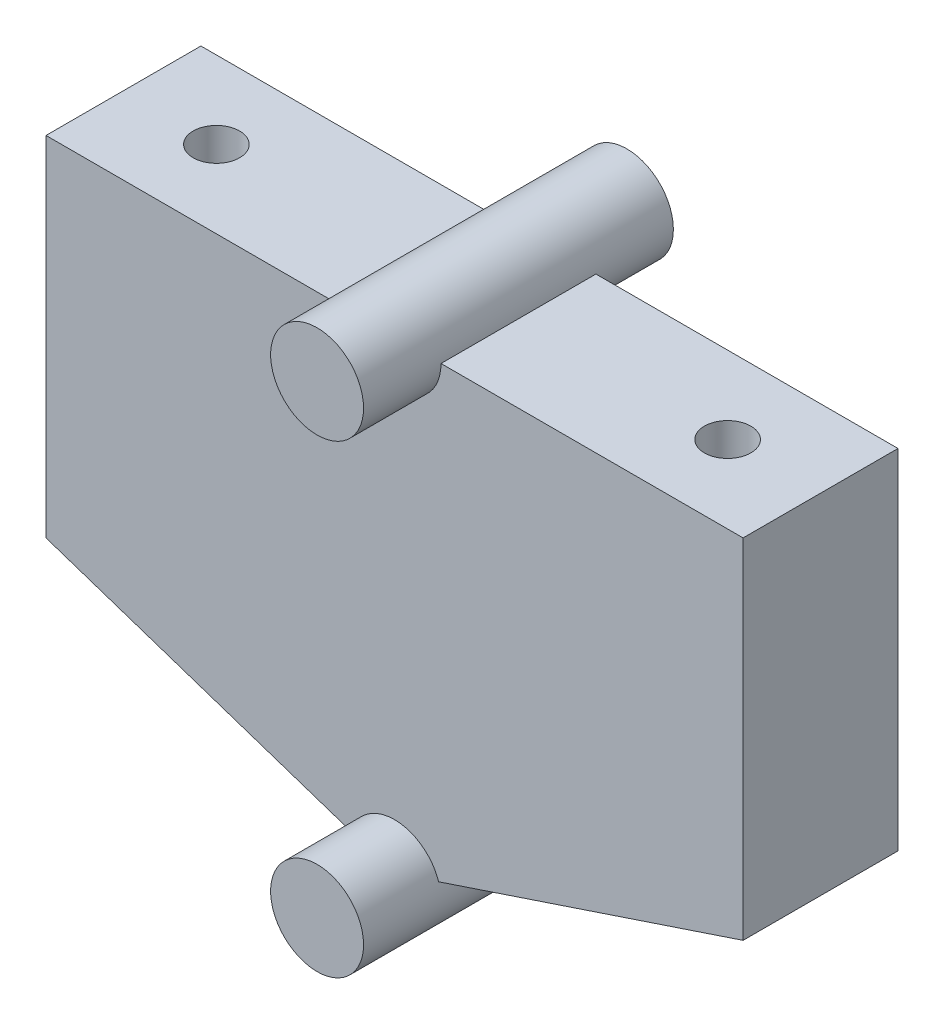
ISO-10303-21;
HEADER;
FILE_DESCRIPTION(('STEP AP214'),'2;1');
FILE_NAME('part.step','',(''),(''),'','','');
FILE_SCHEMA(('AUTOMOTIVE_DESIGN { 1 0 10303 214 1 1 1 1 }'));
ENDSEC;
DATA;
#1=APPLICATION_CONTEXT('core data for automotive mechanical design processes');
#2=APPLICATION_PROTOCOL_DEFINITION('international standard','automotive_design',2000,#1);
#3=PRODUCT_CONTEXT('',#1,'mechanical');
#4=PRODUCT('Part','Part','',(#3));
#5=PRODUCT_RELATED_PRODUCT_CATEGORY('part','',(#4));
#6=PRODUCT_DEFINITION_FORMATION('','',#4);
#7=PRODUCT_DEFINITION_CONTEXT('part definition',#1,'design');
#8=PRODUCT_DEFINITION('design','',#6,#7);
#9=PRODUCT_DEFINITION_SHAPE('','',#8);
#10=(LENGTH_UNIT() NAMED_UNIT(*) SI_UNIT(.MILLI.,.METRE.));
#11=(NAMED_UNIT(*) PLANE_ANGLE_UNIT() SI_UNIT($,.RADIAN.));
#12=(NAMED_UNIT(*) SI_UNIT($,.STERADIAN.) SOLID_ANGLE_UNIT());
#13=UNCERTAINTY_MEASURE_WITH_UNIT(LENGTH_MEASURE(1.E-05),#10,'distance_accuracy_value','');
#14=(GEOMETRIC_REPRESENTATION_CONTEXT(3) GLOBAL_UNCERTAINTY_ASSIGNED_CONTEXT((#13)) GLOBAL_UNIT_ASSIGNED_CONTEXT((#10,
#11,#12)) REPRESENTATION_CONTEXT('',''));
#15=CARTESIAN_POINT('',(0.,0.,0.));
#16=DIRECTION('',(0.,0.,1.));
#17=DIRECTION('',(1.,0.,0.));
#18=AXIS2_PLACEMENT_3D('',#15,#16,#17);
#19=CARTESIAN_POINT('',(0.,-18.75,-5.));
#20=DIRECTION('',(0.,0.,1.));
#21=DIRECTION('',(1.,0.,0.));
#22=AXIS2_PLACEMENT_3D('',#19,#20,#21);
#23=CYLINDRICAL_SURFACE('',#22,3.);
#24=CARTESIAN_POINT('',(0.,-18.75,-5.));
#25=DIRECTION('',(0.,0.,1.));
#26=DIRECTION('',(1.,0.,0.));
#27=AXIS2_PLACEMENT_3D('',#24,#25,#26);
#28=CIRCLE('',#27,3.);
#29=CARTESIAN_POINT('',(3.,-18.75,-5.));
#30=VERTEX_POINT('',#29);
#31=EDGE_CURVE('E11',#30,#30,#28,.T.);
#32=ORIENTED_EDGE('',*,*,#31,.T.);
#33=EDGE_LOOP('',(#32));
#34=FACE_BOUND('',#33,.T.);
#35=CARTESIAN_POINT('',(0.,-18.75,15.));
#36=DIRECTION('',(0.,0.,1.));
#37=DIRECTION('',(1.,0.,0.));
#38=AXIS2_PLACEMENT_3D('',#35,#36,#37);
#39=CIRCLE('',#38,3.);
#40=CARTESIAN_POINT('',(3.,-18.75,15.));
#41=VERTEX_POINT('',#40);
#42=EDGE_CURVE('E51',#41,#41,#39,.T.);
#43=ORIENTED_EDGE('',*,*,#42,.F.);
#44=EDGE_LOOP('',(#43));
#45=FACE_BOUND('',#44,.T.);
#46=ADVANCED_FACE('F45',(#34,#45),#23,.T.);
#47=CARTESIAN_POINT('',(0.,0.,-5.));
#48=DIRECTION('',(0.,0.,1.));
#49=DIRECTION('',(1.,0.,0.));
#50=AXIS2_PLACEMENT_3D('',#47,#48,#49);
#51=PLANE('',#50);
#52=ORIENTED_EDGE('',*,*,#31,.F.);
#53=EDGE_LOOP('',(#52));
#54=FACE_BOUND('',#53,.T.);
#55=ADVANCED_FACE('F60',(#54),#51,.F.);
#56=CARTESIAN_POINT('',(0.,0.,15.));
#57=DIRECTION('',(0.,0.,1.));
#58=DIRECTION('',(1.,0.,0.));
#59=AXIS2_PLACEMENT_3D('',#56,#57,#58);
#60=PLANE('',#59);
#61=ORIENTED_EDGE('',*,*,#42,.T.);
#62=EDGE_LOOP('',(#61));
#63=FACE_BOUND('',#62,.T.);
#64=ADVANCED_FACE('F57',(#63),#60,.T.);
#65=CLOSED_SHELL('',(#46,#55,#64));
#66=MANIFOLD_SOLID_BREP('B2',#65);
#67=CARTESIAN_POINT('',(0.,11.25,10.));
#68=DIRECTION('',(0.,1.,0.));
#69=DIRECTION('',(0.,0.,1.));
#70=AXIS2_PLACEMENT_3D('',#67,#68,#69);
#71=PLANE('',#70);
#72=DIRECTION('',(0.,0.,1.));
#73=VECTOR('',#72,1.);
#74=CARTESIAN_POINT('',(-3.,11.25,-5.));
#75=LINE('',#74,#73);
#76=CARTESIAN_POINT('',(-3.,11.25,0.));
#77=VERTEX_POINT('',#76);
#78=CARTESIAN_POINT('',(-3.,11.25,10.));
#79=VERTEX_POINT('',#78);
#80=EDGE_CURVE('E242',#77,#79,#75,.T.);
#81=ORIENTED_EDGE('',*,*,#80,.F.);
#82=DIRECTION('',(1.,0.,0.));
#83=VECTOR('',#82,1.);
#84=CARTESIAN_POINT('',(0.,11.25,0.));
#85=LINE('',#84,#83);
#86=CARTESIAN_POINT('',(-22.5,11.25,0.));
#87=VERTEX_POINT('',#86);
#88=EDGE_CURVE('E166',#87,#77,#85,.T.);
#89=ORIENTED_EDGE('',*,*,#88,.F.);
#90=DIRECTION('',(0.,0.,-1.));
#91=VECTOR('',#90,1.);
#92=CARTESIAN_POINT('',(-22.5,11.25,10.));
#93=LINE('',#92,#91);
#94=CARTESIAN_POINT('',(-22.5,11.25,10.));
#95=VERTEX_POINT('',#94);
#96=EDGE_CURVE('E159',#95,#87,#93,.T.);
#97=ORIENTED_EDGE('',*,*,#96,.F.);
#98=DIRECTION('',(1.,0.,0.));
#99=VECTOR('',#98,1.);
#100=CARTESIAN_POINT('',(0.,11.25,10.));
#101=LINE('',#100,#99);
#102=EDGE_CURVE('E164',#95,#79,#101,.T.);
#103=ORIENTED_EDGE('',*,*,#102,.T.);
#104=EDGE_LOOP('',(#81,#89,#97,#103));
#105=FACE_BOUND('',#104,.T.);
#106=CARTESIAN_POINT('',(-16.5,11.25,5.));
#107=DIRECTION('',(0.,1.,0.));
#108=DIRECTION('',(0.,0.,1.));
#109=AXIS2_PLACEMENT_3D('',#106,#107,#108);
#110=CIRCLE('',#109,1.5);
#111=CARTESIAN_POINT('',(-16.5,11.25,6.5));
#112=VERTEX_POINT('',#111);
#113=EDGE_CURVE('E213',#112,#112,#110,.T.);
#114=ORIENTED_EDGE('',*,*,#113,.F.);
#115=EDGE_LOOP('',(#114));
#116=FACE_BOUND('',#115,.T.);
#117=ADVANCED_FACE('F92',(#105,#116),#71,.T.);
#118=CARTESIAN_POINT('',(0.,-18.75,10.));
#119=DIRECTION('',(0.,0.,-1.));
#120=DIRECTION('',(-1.,0.,0.));
#121=AXIS2_PLACEMENT_3D('',#118,#119,#120);
#122=CYLINDRICAL_SURFACE('',#121,3.);
#123=CARTESIAN_POINT('',(0.,-18.75,0.));
#124=DIRECTION('',(0.,0.,1.));
#125=DIRECTION('',(1.,0.,0.));
#126=AXIS2_PLACEMENT_3D('',#123,#124,#125);
#127=CIRCLE('',#126,3.);
#128=CARTESIAN_POINT('',(2.84604989415154,-17.8013167019495,0.));
#129=VERTEX_POINT('',#128);
#130=CARTESIAN_POINT('',(-2.84604989415154,-17.8013167019495,0.));
#131=VERTEX_POINT('',#130);
#132=EDGE_CURVE('E188',#129,#131,#127,.T.);
#133=ORIENTED_EDGE('',*,*,#132,.F.);
#134=DIRECTION('',(0.,0.,-1.));
#135=VECTOR('',#134,1.);
#136=CARTESIAN_POINT('',(2.84604989415154,-17.8013167019495,10.));
#137=LINE('',#136,#135);
#138=CARTESIAN_POINT('',(2.84604989415154,-17.8013167019495,10.));
#139=VERTEX_POINT('',#138);
#140=EDGE_CURVE('E100',#139,#129,#137,.T.);
#141=ORIENTED_EDGE('',*,*,#140,.F.);
#142=CARTESIAN_POINT('',(0.,-18.75,10.));
#143=DIRECTION('',(0.,0.,1.));
#144=DIRECTION('',(1.,0.,0.));
#145=AXIS2_PLACEMENT_3D('',#142,#143,#144);
#146=CIRCLE('',#145,3.);
#147=CARTESIAN_POINT('',(-2.84604989415154,-17.8013167019495,10.));
#148=VERTEX_POINT('',#147);
#149=EDGE_CURVE('E204',#139,#148,#146,.T.);
#150=ORIENTED_EDGE('',*,*,#149,.T.);
#151=DIRECTION('',(0.,0.,-1.));
#152=VECTOR('',#151,1.);
#153=CARTESIAN_POINT('',(-2.84604989415154,-17.8013167019495,10.));
#154=LINE('',#153,#152);
#155=EDGE_CURVE('E142',#148,#131,#154,.T.);
#156=ORIENTED_EDGE('',*,*,#155,.T.);
#157=EDGE_LOOP('',(#133,#141,#150,#156));
#158=FACE_BOUND('',#157,.T.);
#159=ADVANCED_FACE('F94',(#158),#122,.F.);
#160=CARTESIAN_POINT('',(5.625,-16.875,10.));
#161=DIRECTION('',(-0.316227766016838,0.948683298050514,0.));
#162=DIRECTION('',(-0.948683298050514,-0.316227766016838,0.));
#163=AXIS2_PLACEMENT_3D('',#160,#161,#162);
#164=PLANE('',#163);
#165=CARTESIAN_POINT('',(16.5,-13.25,5.));
#166=DIRECTION('',(-0.316227766016838,0.948683298050514,0.));
#167=DIRECTION('',(0.948683298050514,0.316227766016838,0.));
#168=AXIS2_PLACEMENT_3D('',#165,#166,#167);
#169=ELLIPSE('',#168,1.58113883008419,1.5);
#170=CARTESIAN_POINT('',(18.,-12.75,5.));
#171=VERTEX_POINT('',#170);
#172=EDGE_CURVE('E192',#171,#171,#169,.T.);
#173=ORIENTED_EDGE('',*,*,#172,.T.);
#174=EDGE_LOOP('',(#173));
#175=FACE_BOUND('',#174,.T.);
#176=DIRECTION('',(0.948683298050514,0.316227766016838,0.));
#177=VECTOR('',#176,1.);
#178=CARTESIAN_POINT('',(5.625,-16.875,0.));
#179=LINE('',#178,#177);
#180=CARTESIAN_POINT('',(22.5,-11.25,0.));
#181=VERTEX_POINT('',#180);
#182=EDGE_CURVE('E191',#129,#181,#179,.T.);
#183=ORIENTED_EDGE('',*,*,#182,.T.);
#184=DIRECTION('',(0.,0.,-1.));
#185=VECTOR('',#184,1.);
#186=CARTESIAN_POINT('',(22.5,-11.25,10.));
#187=LINE('',#186,#185);
#188=CARTESIAN_POINT('',(22.5,-11.25,10.));
#189=VERTEX_POINT('',#188);
#190=EDGE_CURVE('E209',#189,#181,#187,.T.);
#191=ORIENTED_EDGE('',*,*,#190,.F.);
#192=DIRECTION('',(0.948683298050514,0.316227766016838,0.));
#193=VECTOR('',#192,1.);
#194=CARTESIAN_POINT('',(5.625,-16.875,10.));
#195=LINE('',#194,#193);
#196=EDGE_CURVE('E228',#139,#189,#195,.T.);
#197=ORIENTED_EDGE('',*,*,#196,.F.);
#198=ORIENTED_EDGE('',*,*,#140,.T.);
#199=EDGE_LOOP('',(#183,#191,#197,#198));
#200=FACE_BOUND('',#199,.T.);
#201=ADVANCED_FACE('F276',(#175,#200),#164,.F.);
#202=CARTESIAN_POINT('',(22.5,0.,10.));
#203=DIRECTION('',(1.,0.,0.));
#204=DIRECTION('',(0.,1.,0.));
#205=AXIS2_PLACEMENT_3D('',#202,#203,#204);
#206=PLANE('',#205);
#207=DIRECTION('',(0.,-1.,0.));
#208=VECTOR('',#207,1.);
#209=CARTESIAN_POINT('',(22.5,0.,0.));
#210=LINE('',#209,#208);
#211=CARTESIAN_POINT('',(22.5,11.25,0.));
#212=VERTEX_POINT('',#211);
#213=EDGE_CURVE('E195',#212,#181,#210,.T.);
#214=ORIENTED_EDGE('',*,*,#213,.F.);
#215=DIRECTION('',(0.,0.,-1.));
#216=VECTOR('',#215,1.);
#217=CARTESIAN_POINT('',(22.5,11.25,10.));
#218=LINE('',#217,#216);
#219=CARTESIAN_POINT('',(22.5,11.25,10.));
#220=VERTEX_POINT('',#219);
#221=EDGE_CURVE('E169',#220,#212,#218,.T.);
#222=ORIENTED_EDGE('',*,*,#221,.F.);
#223=DIRECTION('',(0.,-1.,0.));
#224=VECTOR('',#223,1.);
#225=CARTESIAN_POINT('',(22.5,0.,10.));
#226=LINE('',#225,#224);
#227=EDGE_CURVE('E183',#220,#189,#226,.T.);
#228=ORIENTED_EDGE('',*,*,#227,.T.);
#229=ORIENTED_EDGE('',*,*,#190,.T.);
#230=EDGE_LOOP('',(#214,#222,#228,#229));
#231=FACE_BOUND('',#230,.T.);
#232=ADVANCED_FACE('F235',(#231),#206,.T.);
#233=DIRECTION('',(0.,0.,1.));
#234=VECTOR('',#233,1.);
#235=CARTESIAN_POINT('',(3.,11.25,-5.));
#236=LINE('',#235,#234);
#237=CARTESIAN_POINT('',(3.,11.25,10.));
#238=VERTEX_POINT('',#237);
#239=CARTESIAN_POINT('',(3.,11.25,0.));
#240=VERTEX_POINT('',#239);
#241=EDGE_CURVE('E107',#238,#240,#236,.F.);
#242=ORIENTED_EDGE('',*,*,#241,.F.);
#243=EDGE_CURVE('E181',#238,#220,#101,.T.);
#244=ORIENTED_EDGE('',*,*,#243,.T.);
#245=ORIENTED_EDGE('',*,*,#221,.T.);
#246=EDGE_CURVE('E198',#240,#212,#85,.T.);
#247=ORIENTED_EDGE('',*,*,#246,.F.);
#248=EDGE_LOOP('',(#242,#244,#245,#247));
#249=FACE_BOUND('',#248,.T.);
#250=CARTESIAN_POINT('',(16.5,11.25,5.));
#251=DIRECTION('',(0.,1.,0.));
#252=DIRECTION('',(0.,0.,-1.));
#253=AXIS2_PLACEMENT_3D('',#250,#251,#252);
#254=CIRCLE('',#253,1.5);
#255=CARTESIAN_POINT('',(16.5,11.25,3.5));
#256=VERTEX_POINT('',#255);
#257=EDGE_CURVE('E219',#256,#256,#254,.T.);
#258=ORIENTED_EDGE('',*,*,#257,.F.);
#259=EDGE_LOOP('',(#258));
#260=FACE_BOUND('',#259,.T.);
#261=ADVANCED_FACE('F239',(#249,#260),#71,.T.);
#262=CARTESIAN_POINT('',(-22.5,0.,10.));
#263=DIRECTION('',(1.,0.,0.));
#264=DIRECTION('',(0.,1.,0.));
#265=AXIS2_PLACEMENT_3D('',#262,#263,#264);
#266=PLANE('',#265);
#267=DIRECTION('',(0.,-1.,0.));
#268=VECTOR('',#267,1.);
#269=CARTESIAN_POINT('',(-22.5,0.,0.));
#270=LINE('',#269,#268);
#271=CARTESIAN_POINT('',(-22.5,-11.25,0.));
#272=VERTEX_POINT('',#271);
#273=EDGE_CURVE('E200',#87,#272,#270,.T.);
#274=ORIENTED_EDGE('',*,*,#273,.T.);
#275=DIRECTION('',(0.,0.,-1.));
#276=VECTOR('',#275,1.);
#277=CARTESIAN_POINT('',(-22.5,-11.25,10.));
#278=LINE('',#277,#276);
#279=CARTESIAN_POINT('',(-22.5,-11.25,10.));
#280=VERTEX_POINT('',#279);
#281=EDGE_CURVE('E170',#280,#272,#278,.T.);
#282=ORIENTED_EDGE('',*,*,#281,.F.);
#283=DIRECTION('',(0.,-1.,0.));
#284=VECTOR('',#283,1.);
#285=CARTESIAN_POINT('',(-22.5,0.,10.));
#286=LINE('',#285,#284);
#287=EDGE_CURVE('E173',#95,#280,#286,.T.);
#288=ORIENTED_EDGE('',*,*,#287,.F.);
#289=ORIENTED_EDGE('',*,*,#96,.T.);
#290=EDGE_LOOP('',(#274,#282,#288,#289));
#291=FACE_BOUND('',#290,.T.);
#292=ADVANCED_FACE('F174',(#291),#266,.F.);
#293=CARTESIAN_POINT('',(-5.625,-16.875,10.));
#294=DIRECTION('',(0.316227766016838,0.948683298050514,0.));
#295=DIRECTION('',(-0.948683298050514,0.316227766016838,0.));
#296=AXIS2_PLACEMENT_3D('',#293,#294,#295);
#297=PLANE('',#296);
#298=CARTESIAN_POINT('',(-16.5,-13.25,5.));
#299=DIRECTION('',(0.316227766016838,0.948683298050514,0.));
#300=DIRECTION('',(-0.948683298050514,0.316227766016838,0.));
#301=AXIS2_PLACEMENT_3D('',#298,#299,#300);
#302=ELLIPSE('',#301,1.58113883008419,1.5);
#303=CARTESIAN_POINT('',(-18.,-12.75,5.));
#304=VERTEX_POINT('',#303);
#305=EDGE_CURVE('E211',#304,#304,#302,.T.);
#306=ORIENTED_EDGE('',*,*,#305,.T.);
#307=EDGE_LOOP('',(#306));
#308=FACE_BOUND('',#307,.T.);
#309=DIRECTION('',(0.948683298050514,-0.316227766016838,0.));
#310=VECTOR('',#309,1.);
#311=CARTESIAN_POINT('',(-5.625,-16.875,0.));
#312=LINE('',#311,#310);
#313=EDGE_CURVE('E202',#272,#131,#312,.T.);
#314=ORIENTED_EDGE('',*,*,#313,.T.);
#315=ORIENTED_EDGE('',*,*,#155,.F.);
#316=DIRECTION('',(0.948683298050514,-0.316227766016838,0.));
#317=VECTOR('',#316,1.);
#318=CARTESIAN_POINT('',(-5.625,-16.875,10.));
#319=LINE('',#318,#317);
#320=EDGE_CURVE('E115',#280,#148,#319,.T.);
#321=ORIENTED_EDGE('',*,*,#320,.F.);
#322=ORIENTED_EDGE('',*,*,#281,.T.);
#323=EDGE_LOOP('',(#314,#315,#321,#322));
#324=FACE_BOUND('',#323,.T.);
#325=ADVANCED_FACE('F284',(#308,#324),#297,.F.);
#326=CARTESIAN_POINT('',(0.,0.,10.));
#327=DIRECTION('',(0.,0.,1.));
#328=DIRECTION('',(1.,0.,0.));
#329=AXIS2_PLACEMENT_3D('',#326,#327,#328);
#330=PLANE('',#329);
#331=CARTESIAN_POINT('',(0.,11.25,10.));
#332=DIRECTION('',(0.,0.,1.));
#333=DIRECTION('',(1.,0.,0.));
#334=AXIS2_PLACEMENT_3D('',#331,#332,#333);
#335=CIRCLE('',#334,3.);
#336=EDGE_CURVE('E180',#79,#238,#335,.T.);
#337=ORIENTED_EDGE('',*,*,#336,.F.);
#338=ORIENTED_EDGE('',*,*,#102,.F.);
#339=ORIENTED_EDGE('',*,*,#287,.T.);
#340=ORIENTED_EDGE('',*,*,#320,.T.);
#341=ORIENTED_EDGE('',*,*,#149,.F.);
#342=ORIENTED_EDGE('',*,*,#196,.T.);
#343=ORIENTED_EDGE('',*,*,#227,.F.);
#344=ORIENTED_EDGE('',*,*,#243,.F.);
#345=EDGE_LOOP('',(#337,#338,#339,#340,#341,#342,#343,#344));
#346=FACE_BOUND('',#345,.T.);
#347=ADVANCED_FACE('F178',(#346),#330,.T.);
#348=CARTESIAN_POINT('',(0.,0.,0.));
#349=DIRECTION('',(0.,0.,1.));
#350=DIRECTION('',(1.,0.,0.));
#351=AXIS2_PLACEMENT_3D('',#348,#349,#350);
#352=PLANE('',#351);
#353=ORIENTED_EDGE('',*,*,#88,.T.);
#354=CARTESIAN_POINT('',(0.,11.25,0.));
#355=DIRECTION('',(0.,0.,1.));
#356=DIRECTION('',(1.,0.,0.));
#357=AXIS2_PLACEMENT_3D('',#354,#355,#356);
#358=CIRCLE('',#357,3.);
#359=EDGE_CURVE('E43',#77,#240,#358,.T.);
#360=ORIENTED_EDGE('',*,*,#359,.T.);
#361=ORIENTED_EDGE('',*,*,#246,.T.);
#362=ORIENTED_EDGE('',*,*,#213,.T.);
#363=ORIENTED_EDGE('',*,*,#182,.F.);
#364=ORIENTED_EDGE('',*,*,#132,.T.);
#365=ORIENTED_EDGE('',*,*,#313,.F.);
#366=ORIENTED_EDGE('',*,*,#273,.F.);
#367=EDGE_LOOP('',(#353,#360,#361,#362,#363,#364,#365,#366));
#368=FACE_BOUND('',#367,.T.);
#369=ADVANCED_FACE('F295',(#368),#352,.F.);
#370=CARTESIAN_POINT('',(-16.5,-21.75,5.));
#371=DIRECTION('',(0.,1.,0.));
#372=DIRECTION('',(0.,0.,1.));
#373=AXIS2_PLACEMENT_3D('',#370,#371,#372);
#374=CYLINDRICAL_SURFACE('',#373,1.5);
#375=ORIENTED_EDGE('',*,*,#113,.T.);
#376=EDGE_LOOP('',(#375));
#377=FACE_BOUND('',#376,.T.);
#378=ORIENTED_EDGE('',*,*,#305,.F.);
#379=EDGE_LOOP('',(#378));
#380=FACE_BOUND('',#379,.T.);
#381=ADVANCED_FACE('F266',(#377,#380),#374,.F.);
#382=CARTESIAN_POINT('',(16.5,-21.75,5.));
#383=DIRECTION('',(0.,1.,0.));
#384=DIRECTION('',(0.,0.,1.));
#385=AXIS2_PLACEMENT_3D('',#382,#383,#384);
#386=CYLINDRICAL_SURFACE('',#385,1.5);
#387=ORIENTED_EDGE('',*,*,#257,.T.);
#388=EDGE_LOOP('',(#387));
#389=FACE_BOUND('',#388,.T.);
#390=ORIENTED_EDGE('',*,*,#172,.F.);
#391=EDGE_LOOP('',(#390));
#392=FACE_BOUND('',#391,.T.);
#393=ADVANCED_FACE('F258',(#389,#392),#386,.F.);
#394=CARTESIAN_POINT('',(0.,11.25,-5.));
#395=DIRECTION('',(0.,0.,1.));
#396=DIRECTION('',(1.,0.,0.));
#397=AXIS2_PLACEMENT_3D('',#394,#395,#396);
#398=CYLINDRICAL_SURFACE('',#397,3.);
#399=ORIENTED_EDGE('',*,*,#80,.T.);
#400=ORIENTED_EDGE('',*,*,#336,.T.);
#401=ORIENTED_EDGE('',*,*,#241,.T.);
#402=ORIENTED_EDGE('',*,*,#359,.F.);
#403=EDGE_LOOP('',(#399,#400,#401,#402));
#404=FACE_BOUND('',#403,.T.);
#405=CARTESIAN_POINT('',(0.,11.25,-5.));
#406=DIRECTION('',(0.,0.,1.));
#407=DIRECTION('',(1.,0.,0.));
#408=AXIS2_PLACEMENT_3D('',#405,#406,#407);
#409=CIRCLE('',#408,3.);
#410=CARTESIAN_POINT('',(3.,11.25,-5.));
#411=VERTEX_POINT('',#410);
#412=EDGE_CURVE('E243',#411,#411,#409,.T.);
#413=ORIENTED_EDGE('',*,*,#412,.T.);
#414=EDGE_LOOP('',(#413));
#415=FACE_BOUND('',#414,.T.);
#416=CARTESIAN_POINT('',(0.,11.25,15.));
#417=DIRECTION('',(0.,0.,1.));
#418=DIRECTION('',(1.,0.,0.));
#419=AXIS2_PLACEMENT_3D('',#416,#417,#418);
#420=CIRCLE('',#419,3.);
#421=CARTESIAN_POINT('',(3.,11.25,15.));
#422=VERTEX_POINT('',#421);
#423=EDGE_CURVE('E247',#422,#422,#420,.T.);
#424=ORIENTED_EDGE('',*,*,#423,.F.);
#425=EDGE_LOOP('',(#424));
#426=FACE_BOUND('',#425,.T.);
#427=ADVANCED_FACE('F255',(#404,#415,#426),#398,.T.);
#428=CARTESIAN_POINT('',(0.,11.25,-5.));
#429=DIRECTION('',(0.,0.,1.));
#430=DIRECTION('',(1.,0.,0.));
#431=AXIS2_PLACEMENT_3D('',#428,#429,#430);
#432=PLANE('',#431);
#433=ORIENTED_EDGE('',*,*,#412,.F.);
#434=EDGE_LOOP('',(#433));
#435=FACE_BOUND('',#434,.T.);
#436=ADVANCED_FACE('F257',(#435),#432,.F.);
#437=CARTESIAN_POINT('',(0.,11.25,15.));
#438=DIRECTION('',(0.,0.,1.));
#439=DIRECTION('',(1.,0.,0.));
#440=AXIS2_PLACEMENT_3D('',#437,#438,#439);
#441=PLANE('',#440);
#442=ORIENTED_EDGE('',*,*,#423,.T.);
#443=EDGE_LOOP('',(#442));
#444=FACE_BOUND('',#443,.T.);
#445=ADVANCED_FACE('F253',(#444),#441,.T.);
#446=CLOSED_SHELL('',(#117,#159,#201,#232,#261,#292,#325,#347,#369,#381,#393,#427,#436,#445));
#447=MANIFOLD_SOLID_BREP('B6',#446);
#448=ADVANCED_BREP_SHAPE_REPRESENTATION('',(#18,#66,#447),#14);
#449=SHAPE_DEFINITION_REPRESENTATION(#9,#448);
ENDSEC;
END-ISO-10303-21;
